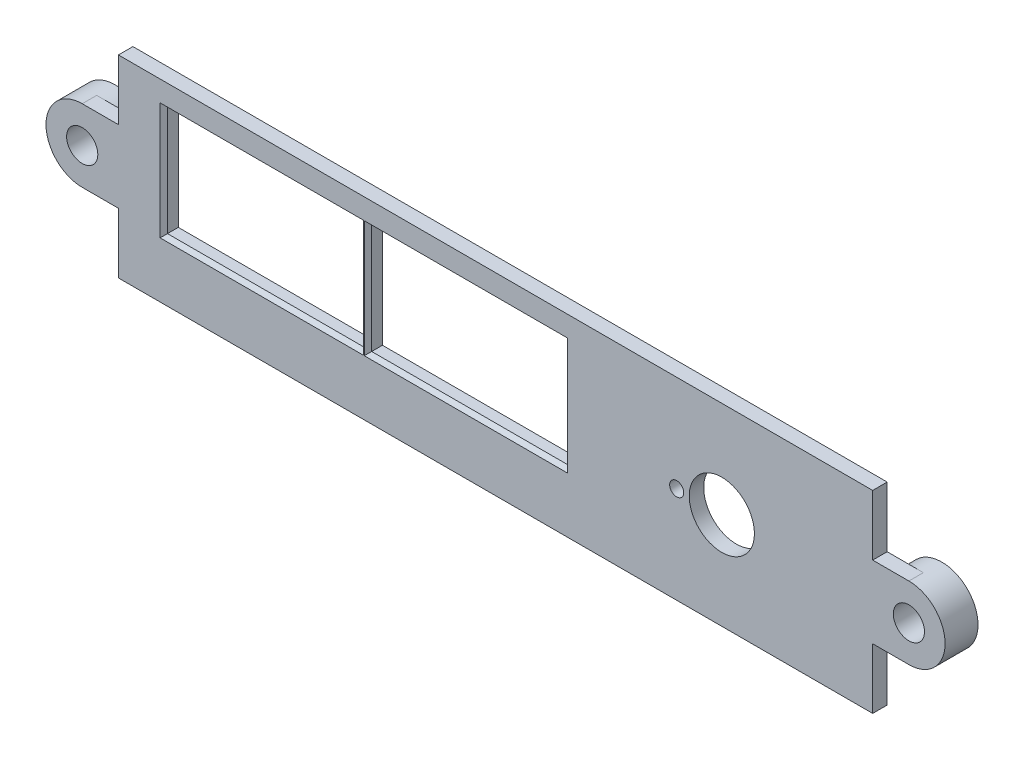
ISO-10303-21;
HEADER;
FILE_DESCRIPTION(('STEP AP214'),'2;1');
FILE_NAME('part.step','',(''),(''),'','','');
FILE_SCHEMA(('AUTOMOTIVE_DESIGN { 1 0 10303 214 1 1 1 1 }'));
ENDSEC;
DATA;
#1=APPLICATION_CONTEXT('core data for automotive mechanical design processes');
#2=APPLICATION_PROTOCOL_DEFINITION('international standard','automotive_design',2000,#1);
#3=PRODUCT_CONTEXT('',#1,'mechanical');
#4=PRODUCT('Part','Part','',(#3));
#5=PRODUCT_RELATED_PRODUCT_CATEGORY('part','',(#4));
#6=PRODUCT_DEFINITION_FORMATION('','',#4);
#7=PRODUCT_DEFINITION_CONTEXT('part definition',#1,'design');
#8=PRODUCT_DEFINITION('design','',#6,#7);
#9=PRODUCT_DEFINITION_SHAPE('','',#8);
#10=(LENGTH_UNIT() NAMED_UNIT(*) SI_UNIT(.MILLI.,.METRE.));
#11=(NAMED_UNIT(*) PLANE_ANGLE_UNIT() SI_UNIT($,.RADIAN.));
#12=(NAMED_UNIT(*) SI_UNIT($,.STERADIAN.) SOLID_ANGLE_UNIT());
#13=UNCERTAINTY_MEASURE_WITH_UNIT(LENGTH_MEASURE(1.E-05),#10,'distance_accuracy_value','');
#14=(GEOMETRIC_REPRESENTATION_CONTEXT(3) GLOBAL_UNCERTAINTY_ASSIGNED_CONTEXT((#13)) GLOBAL_UNIT_ASSIGNED_CONTEXT((#10,
#11,#12)) REPRESENTATION_CONTEXT('',''));
#15=CARTESIAN_POINT('',(0.,0.,0.));
#16=DIRECTION('',(0.,0.,1.));
#17=DIRECTION('',(1.,0.,0.));
#18=AXIS2_PLACEMENT_3D('',#15,#16,#17);
#19=CARTESIAN_POINT('',(-52.07,-13.335,2.));
#20=DIRECTION('',(1.,0.,0.));
#21=DIRECTION('',(0.,0.,-1.));
#22=AXIS2_PLACEMENT_3D('',#19,#20,#21);
#23=PLANE('',#22);
#24=DIRECTION('',(0.,-1.,0.));
#25=VECTOR('',#24,1.);
#26=CARTESIAN_POINT('',(-52.07,-13.335,0.));
#27=LINE('',#26,#25);
#28=CARTESIAN_POINT('',(-52.07,-5.00000016,0.));
#29=VERTEX_POINT('',#28);
#30=CARTESIAN_POINT('',(-52.07,-13.335,0.));
#31=VERTEX_POINT('',#30);
#32=EDGE_CURVE('E415',#29,#31,#27,.T.);
#33=ORIENTED_EDGE('',*,*,#32,.T.);
#34=DIRECTION('',(0.,0.,-1.));
#35=VECTOR('',#34,1.);
#36=CARTESIAN_POINT('',(-52.07,-13.335,2.));
#37=LINE('',#36,#35);
#38=CARTESIAN_POINT('',(-52.07,-13.335,2.));
#39=VERTEX_POINT('',#38);
#40=EDGE_CURVE('E419',#39,#31,#37,.T.);
#41=ORIENTED_EDGE('',*,*,#40,.F.);
#42=DIRECTION('',(0.,-1.,0.));
#43=VECTOR('',#42,1.);
#44=CARTESIAN_POINT('',(-52.07,-13.335,2.));
#45=LINE('',#44,#43);
#46=CARTESIAN_POINT('',(-52.07,-5.00000016,2.));
#47=VERTEX_POINT('',#46);
#48=EDGE_CURVE('E426',#47,#39,#45,.T.);
#49=ORIENTED_EDGE('',*,*,#48,.F.);
#50=DIRECTION('',(0.,0.,-1.));
#51=VECTOR('',#50,1.);
#52=CARTESIAN_POINT('',(-52.07,-5.00000016,2.));
#53=LINE('',#52,#51);
#54=EDGE_CURVE('E464',#47,#29,#53,.T.);
#55=ORIENTED_EDGE('',*,*,#54,.T.);
#56=EDGE_LOOP('',(#33,#41,#49,#55));
#57=FACE_BOUND('',#56,.T.);
#58=ADVANCED_FACE('F47',(#57),#23,.F.);
#59=CARTESIAN_POINT('',(-52.07,-13.335,2.));
#60=DIRECTION('',(0.,1.,0.));
#61=DIRECTION('',(-1.,0.,0.));
#62=AXIS2_PLACEMENT_3D('',#59,#60,#61);
#63=PLANE('',#62);
#64=DIRECTION('',(1.,0.,0.));
#65=VECTOR('',#64,1.);
#66=CARTESIAN_POINT('',(-52.07,-13.335,0.));
#67=LINE('',#66,#65);
#68=CARTESIAN_POINT('',(52.07,-13.335,0.));
#69=VERTEX_POINT('',#68);
#70=EDGE_CURVE('E468',#31,#69,#67,.T.);
#71=ORIENTED_EDGE('',*,*,#70,.T.);
#72=DIRECTION('',(0.,0.,-1.));
#73=VECTOR('',#72,1.);
#74=CARTESIAN_POINT('',(52.07,-13.335,2.));
#75=LINE('',#74,#73);
#76=CARTESIAN_POINT('',(52.07,-13.335,2.));
#77=VERTEX_POINT('',#76);
#78=EDGE_CURVE('E535',#77,#69,#75,.T.);
#79=ORIENTED_EDGE('',*,*,#78,.F.);
#80=DIRECTION('',(1.,0.,0.));
#81=VECTOR('',#80,1.);
#82=CARTESIAN_POINT('',(-52.07,-13.335,2.));
#83=LINE('',#82,#81);
#84=EDGE_CURVE('E430',#39,#77,#83,.T.);
#85=ORIENTED_EDGE('',*,*,#84,.F.);
#86=ORIENTED_EDGE('',*,*,#40,.T.);
#87=EDGE_LOOP('',(#71,#79,#85,#86));
#88=FACE_BOUND('',#87,.T.);
#89=ADVANCED_FACE('F582',(#88),#63,.F.);
#90=CARTESIAN_POINT('',(52.07,-13.335,2.));
#91=DIRECTION('',(-1.,0.,0.));
#92=DIRECTION('',(0.,0.,1.));
#93=AXIS2_PLACEMENT_3D('',#90,#91,#92);
#94=PLANE('',#93);
#95=DIRECTION('',(0.,1.,0.));
#96=VECTOR('',#95,1.);
#97=CARTESIAN_POINT('',(52.07,-13.335,0.));
#98=LINE('',#97,#96);
#99=CARTESIAN_POINT('',(52.07,-5.00000015999999,0.));
#100=VERTEX_POINT('',#99);
#101=EDGE_CURVE('E471',#69,#100,#98,.T.);
#102=ORIENTED_EDGE('',*,*,#101,.T.);
#103=DIRECTION('',(0.,0.,-1.));
#104=VECTOR('',#103,1.);
#105=CARTESIAN_POINT('',(52.07,-5.00000015999999,2.));
#106=LINE('',#105,#104);
#107=CARTESIAN_POINT('',(52.07,-5.00000015999999,2.));
#108=VERTEX_POINT('',#107);
#109=EDGE_CURVE('E531',#108,#100,#106,.T.);
#110=ORIENTED_EDGE('',*,*,#109,.F.);
#111=DIRECTION('',(0.,1.,0.));
#112=VECTOR('',#111,1.);
#113=CARTESIAN_POINT('',(52.07,-13.335,2.));
#114=LINE('',#113,#112);
#115=EDGE_CURVE('E434',#77,#108,#114,.T.);
#116=ORIENTED_EDGE('',*,*,#115,.F.);
#117=ORIENTED_EDGE('',*,*,#78,.T.);
#118=EDGE_LOOP('',(#102,#110,#116,#117));
#119=FACE_BOUND('',#118,.T.);
#120=ADVANCED_FACE('F588',(#119),#94,.F.);
#121=CARTESIAN_POINT('',(57.07000016,-5.00000015999999,2.));
#122=DIRECTION('',(0.,1.,0.));
#123=DIRECTION('',(-1.,0.,0.));
#124=AXIS2_PLACEMENT_3D('',#121,#122,#123);
#125=PLANE('',#124);
#126=DIRECTION('',(1.,0.,0.));
#127=VECTOR('',#126,1.);
#128=CARTESIAN_POINT('',(57.07000016,-5.00000015999999,0.));
#129=LINE('',#128,#127);
#130=CARTESIAN_POINT('',(57.07000016,-5.00000015999999,0.));
#131=VERTEX_POINT('',#130);
#132=EDGE_CURVE('E474',#100,#131,#129,.T.);
#133=ORIENTED_EDGE('',*,*,#132,.T.);
#134=DIRECTION('',(0.,0.,-1.));
#135=VECTOR('',#134,1.);
#136=CARTESIAN_POINT('',(57.07000016,-5.00000015999999,2.));
#137=LINE('',#136,#135);
#138=CARTESIAN_POINT('',(57.07000016,-5.00000015999999,2.));
#139=VERTEX_POINT('',#138);
#140=EDGE_CURVE('E527',#139,#131,#137,.T.);
#141=ORIENTED_EDGE('',*,*,#140,.F.);
#142=DIRECTION('',(1.,0.,0.));
#143=VECTOR('',#142,1.);
#144=CARTESIAN_POINT('',(57.07000016,-5.00000015999999,2.));
#145=LINE('',#144,#143);
#146=EDGE_CURVE('E437',#108,#139,#145,.T.);
#147=ORIENTED_EDGE('',*,*,#146,.F.);
#148=ORIENTED_EDGE('',*,*,#109,.T.);
#149=EDGE_LOOP('',(#133,#141,#147,#148));
#150=FACE_BOUND('',#149,.T.);
#151=ADVANCED_FACE('F824',(#150),#125,.F.);
#152=CARTESIAN_POINT('',(57.07000016,0.,2.));
#153=DIRECTION('',(0.,0.,-1.));
#154=DIRECTION('',(-1.,0.,0.));
#155=AXIS2_PLACEMENT_3D('',#152,#153,#154);
#156=CYLINDRICAL_SURFACE('',#155,5.00000016);
#157=ORIENTED_EDGE('',*,*,#140,.T.);
#158=CARTESIAN_POINT('',(57.07000016,0.,0.));
#159=DIRECTION('',(0.,0.,1.));
#160=DIRECTION('',(1.,0.,0.));
#161=AXIS2_PLACEMENT_3D('',#158,#159,#160);
#162=CIRCLE('',#161,5.00000016);
#163=CARTESIAN_POINT('',(57.07000016,5.00000016000001,0.));
#164=VERTEX_POINT('',#163);
#165=EDGE_CURVE('E416',#164,#131,#162,.T.);
#166=ORIENTED_EDGE('',*,*,#165,.F.);
#167=DIRECTION('',(0.,0.,-1.));
#168=VECTOR('',#167,1.);
#169=CARTESIAN_POINT('',(57.07000016,5.00000016000001,2.));
#170=LINE('',#169,#168);
#171=CARTESIAN_POINT('',(57.07000016,5.00000016000001,2.));
#172=VERTEX_POINT('',#171);
#173=EDGE_CURVE('E523',#172,#164,#170,.T.);
#174=ORIENTED_EDGE('',*,*,#173,.F.);
#175=CARTESIAN_POINT('',(57.07000016,0.,2.));
#176=DIRECTION('',(0.,0.,1.));
#177=DIRECTION('',(-1.,0.,0.));
#178=AXIS2_PLACEMENT_3D('',#175,#176,#177);
#179=CIRCLE('',#178,5.00000016);
#180=EDGE_CURVE('E440',#139,#172,#179,.T.);
#181=ORIENTED_EDGE('',*,*,#180,.F.);
#182=EDGE_LOOP('',(#157,#166,#174,#181));
#183=FACE_BOUND('',#182,.T.);
#184=CARTESIAN_POINT('',(57.07000016,0.,-2.54));
#185=DIRECTION('',(0.,0.,1.));
#186=DIRECTION('',(1.,0.,0.));
#187=AXIS2_PLACEMENT_3D('',#184,#185,#186);
#188=CIRCLE('',#187,5.00000016);
#189=CARTESIAN_POINT('',(62.07000032,0.,-2.54));
#190=VERTEX_POINT('',#189);
#191=EDGE_CURVE('E422',#190,#190,#188,.T.);
#192=ORIENTED_EDGE('',*,*,#191,.T.);
#193=EDGE_LOOP('',(#192));
#194=FACE_BOUND('',#193,.T.);
#195=ADVANCED_FACE('F817',(#183,#194),#156,.T.);
#196=CARTESIAN_POINT('',(52.07,5.00000016000002,2.));
#197=DIRECTION('',(0.,-1.,0.));
#198=DIRECTION('',(1.,0.,0.));
#199=AXIS2_PLACEMENT_3D('',#196,#197,#198);
#200=PLANE('',#199);
#201=DIRECTION('',(-1.,0.,0.));
#202=VECTOR('',#201,1.);
#203=CARTESIAN_POINT('',(52.07,5.00000016000002,0.));
#204=LINE('',#203,#202);
#205=CARTESIAN_POINT('',(52.07,5.00000016000002,0.));
#206=VERTEX_POINT('',#205);
#207=EDGE_CURVE('E478',#164,#206,#204,.T.);
#208=ORIENTED_EDGE('',*,*,#207,.T.);
#209=DIRECTION('',(0.,0.,-1.));
#210=VECTOR('',#209,1.);
#211=CARTESIAN_POINT('',(52.07,5.00000016000002,2.));
#212=LINE('',#211,#210);
#213=CARTESIAN_POINT('',(52.07,5.00000016000002,2.));
#214=VERTEX_POINT('',#213);
#215=EDGE_CURVE('E519',#214,#206,#212,.T.);
#216=ORIENTED_EDGE('',*,*,#215,.F.);
#217=DIRECTION('',(-1.,0.,0.));
#218=VECTOR('',#217,1.);
#219=CARTESIAN_POINT('',(52.07,5.00000016000002,2.));
#220=LINE('',#219,#218);
#221=EDGE_CURVE('E443',#172,#214,#220,.T.);
#222=ORIENTED_EDGE('',*,*,#221,.F.);
#223=ORIENTED_EDGE('',*,*,#173,.T.);
#224=EDGE_LOOP('',(#208,#216,#222,#223));
#225=FACE_BOUND('',#224,.T.);
#226=ADVANCED_FACE('F823',(#225),#200,.F.);
#227=CARTESIAN_POINT('',(52.07,5.00000016000002,2.));
#228=DIRECTION('',(-1.,0.,0.));
#229=DIRECTION('',(0.,0.,1.));
#230=AXIS2_PLACEMENT_3D('',#227,#228,#229);
#231=PLANE('',#230);
#232=DIRECTION('',(0.,1.,0.));
#233=VECTOR('',#232,1.);
#234=CARTESIAN_POINT('',(52.07,5.00000016000002,0.));
#235=LINE('',#234,#233);
#236=CARTESIAN_POINT('',(52.07,13.335,0.));
#237=VERTEX_POINT('',#236);
#238=EDGE_CURVE('E481',#206,#237,#235,.T.);
#239=ORIENTED_EDGE('',*,*,#238,.T.);
#240=DIRECTION('',(0.,0.,-1.));
#241=VECTOR('',#240,1.);
#242=CARTESIAN_POINT('',(52.07,13.335,2.));
#243=LINE('',#242,#241);
#244=CARTESIAN_POINT('',(52.07,13.335,2.));
#245=VERTEX_POINT('',#244);
#246=EDGE_CURVE('E515',#245,#237,#243,.T.);
#247=ORIENTED_EDGE('',*,*,#246,.F.);
#248=DIRECTION('',(0.,1.,0.));
#249=VECTOR('',#248,1.);
#250=CARTESIAN_POINT('',(52.07,5.00000016000002,2.));
#251=LINE('',#250,#249);
#252=EDGE_CURVE('E446',#214,#245,#251,.T.);
#253=ORIENTED_EDGE('',*,*,#252,.F.);
#254=ORIENTED_EDGE('',*,*,#215,.T.);
#255=EDGE_LOOP('',(#239,#247,#253,#254));
#256=FACE_BOUND('',#255,.T.);
#257=ADVANCED_FACE('F877',(#256),#231,.F.);
#258=CARTESIAN_POINT('',(-52.07,13.335,2.));
#259=DIRECTION('',(0.,-1.,0.));
#260=DIRECTION('',(1.,0.,0.));
#261=AXIS2_PLACEMENT_3D('',#258,#259,#260);
#262=PLANE('',#261);
#263=DIRECTION('',(-1.,0.,0.));
#264=VECTOR('',#263,1.);
#265=CARTESIAN_POINT('',(-52.07,13.335,0.));
#266=LINE('',#265,#264);
#267=CARTESIAN_POINT('',(-52.07,13.335,0.));
#268=VERTEX_POINT('',#267);
#269=EDGE_CURVE('E484',#237,#268,#266,.T.);
#270=ORIENTED_EDGE('',*,*,#269,.T.);
#271=DIRECTION('',(0.,0.,-1.));
#272=VECTOR('',#271,1.);
#273=CARTESIAN_POINT('',(-52.07,13.335,2.));
#274=LINE('',#273,#272);
#275=CARTESIAN_POINT('',(-52.07,13.335,2.));
#276=VERTEX_POINT('',#275);
#277=EDGE_CURVE('E511',#276,#268,#274,.T.);
#278=ORIENTED_EDGE('',*,*,#277,.F.);
#279=DIRECTION('',(-1.,0.,0.));
#280=VECTOR('',#279,1.);
#281=CARTESIAN_POINT('',(-52.07,13.335,2.));
#282=LINE('',#281,#280);
#283=EDGE_CURVE('E449',#245,#276,#282,.T.);
#284=ORIENTED_EDGE('',*,*,#283,.F.);
#285=ORIENTED_EDGE('',*,*,#246,.T.);
#286=EDGE_LOOP('',(#270,#278,#284,#285));
#287=FACE_BOUND('',#286,.T.);
#288=ADVANCED_FACE('F868',(#287),#262,.F.);
#289=CARTESIAN_POINT('',(-52.07,5.00000016,2.));
#290=DIRECTION('',(1.,0.,0.));
#291=DIRECTION('',(0.,0.,-1.));
#292=AXIS2_PLACEMENT_3D('',#289,#290,#291);
#293=PLANE('',#292);
#294=DIRECTION('',(0.,-1.,0.));
#295=VECTOR('',#294,1.);
#296=CARTESIAN_POINT('',(-52.07,5.00000016,0.));
#297=LINE('',#296,#295);
#298=CARTESIAN_POINT('',(-52.07,5.00000016,0.));
#299=VERTEX_POINT('',#298);
#300=EDGE_CURVE('E487',#268,#299,#297,.T.);
#301=ORIENTED_EDGE('',*,*,#300,.T.);
#302=DIRECTION('',(0.,0.,-1.));
#303=VECTOR('',#302,1.);
#304=CARTESIAN_POINT('',(-52.07,5.00000016,2.));
#305=LINE('',#304,#303);
#306=CARTESIAN_POINT('',(-52.07,5.00000016,2.));
#307=VERTEX_POINT('',#306);
#308=EDGE_CURVE('E507',#307,#299,#305,.T.);
#309=ORIENTED_EDGE('',*,*,#308,.F.);
#310=DIRECTION('',(0.,-1.,0.));
#311=VECTOR('',#310,1.);
#312=CARTESIAN_POINT('',(-52.07,5.00000016,2.));
#313=LINE('',#312,#311);
#314=EDGE_CURVE('E452',#276,#307,#313,.T.);
#315=ORIENTED_EDGE('',*,*,#314,.F.);
#316=ORIENTED_EDGE('',*,*,#277,.T.);
#317=EDGE_LOOP('',(#301,#309,#315,#316));
#318=FACE_BOUND('',#317,.T.);
#319=ADVANCED_FACE('F859',(#318),#293,.F.);
#320=CARTESIAN_POINT('',(-52.07,5.00000016,2.));
#321=DIRECTION('',(0.,-1.,0.));
#322=DIRECTION('',(1.,0.,0.));
#323=AXIS2_PLACEMENT_3D('',#320,#321,#322);
#324=PLANE('',#323);
#325=DIRECTION('',(-1.,0.,0.));
#326=VECTOR('',#325,1.);
#327=CARTESIAN_POINT('',(-52.07,5.00000016,0.));
#328=LINE('',#327,#326);
#329=CARTESIAN_POINT('',(-57.07000016,5.00000016,0.));
#330=VERTEX_POINT('',#329);
#331=EDGE_CURVE('E490',#299,#330,#328,.T.);
#332=ORIENTED_EDGE('',*,*,#331,.T.);
#333=DIRECTION('',(0.,0.,-1.));
#334=VECTOR('',#333,1.);
#335=CARTESIAN_POINT('',(-57.07000016,5.00000016,2.));
#336=LINE('',#335,#334);
#337=CARTESIAN_POINT('',(-57.07000016,5.00000016,2.));
#338=VERTEX_POINT('',#337);
#339=EDGE_CURVE('E503',#338,#330,#336,.T.);
#340=ORIENTED_EDGE('',*,*,#339,.F.);
#341=DIRECTION('',(-1.,0.,0.));
#342=VECTOR('',#341,1.);
#343=CARTESIAN_POINT('',(-52.07,5.00000016,2.));
#344=LINE('',#343,#342);
#345=EDGE_CURVE('E455',#307,#338,#344,.T.);
#346=ORIENTED_EDGE('',*,*,#345,.F.);
#347=ORIENTED_EDGE('',*,*,#308,.T.);
#348=EDGE_LOOP('',(#332,#340,#346,#347));
#349=FACE_BOUND('',#348,.T.);
#350=ADVANCED_FACE('F807',(#349),#324,.F.);
#351=CARTESIAN_POINT('',(-57.07000016,0.,2.));
#352=DIRECTION('',(0.,0.,-1.));
#353=DIRECTION('',(-1.,0.,0.));
#354=AXIS2_PLACEMENT_3D('',#351,#352,#353);
#355=CYLINDRICAL_SURFACE('',#354,5.00000016);
#356=ORIENTED_EDGE('',*,*,#339,.T.);
#357=CARTESIAN_POINT('',(-57.07000016,0.,0.));
#358=DIRECTION('',(0.,0.,1.));
#359=DIRECTION('',(1.,0.,0.));
#360=AXIS2_PLACEMENT_3D('',#357,#358,#359);
#361=CIRCLE('',#360,5.00000016);
#362=CARTESIAN_POINT('',(-57.07000016,-5.00000016,0.));
#363=VERTEX_POINT('',#362);
#364=EDGE_CURVE('E226',#363,#330,#361,.T.);
#365=ORIENTED_EDGE('',*,*,#364,.F.);
#366=DIRECTION('',(0.,0.,-1.));
#367=VECTOR('',#366,1.);
#368=CARTESIAN_POINT('',(-57.07000016,-5.00000016,2.));
#369=LINE('',#368,#367);
#370=CARTESIAN_POINT('',(-57.07000016,-5.00000016,2.));
#371=VERTEX_POINT('',#370);
#372=EDGE_CURVE('E499',#371,#363,#369,.T.);
#373=ORIENTED_EDGE('',*,*,#372,.F.);
#374=CARTESIAN_POINT('',(-57.07000016,0.,2.));
#375=DIRECTION('',(0.,0.,1.));
#376=DIRECTION('',(1.,0.,0.));
#377=AXIS2_PLACEMENT_3D('',#374,#375,#376);
#378=CIRCLE('',#377,5.00000016);
#379=EDGE_CURVE('E458',#338,#371,#378,.T.);
#380=ORIENTED_EDGE('',*,*,#379,.F.);
#381=EDGE_LOOP('',(#356,#365,#373,#380));
#382=FACE_BOUND('',#381,.T.);
#383=CARTESIAN_POINT('',(-57.07000016,0.,-2.54));
#384=DIRECTION('',(0.,0.,1.));
#385=DIRECTION('',(1.,0.,0.));
#386=AXIS2_PLACEMENT_3D('',#383,#384,#385);
#387=CIRCLE('',#386,5.00000016);
#388=CARTESIAN_POINT('',(-52.07,0.,-2.54));
#389=VERTEX_POINT('',#388);
#390=EDGE_CURVE('E411',#389,#389,#387,.T.);
#391=ORIENTED_EDGE('',*,*,#390,.T.);
#392=EDGE_LOOP('',(#391));
#393=FACE_BOUND('',#392,.T.);
#394=ADVANCED_FACE('F800',(#382,#393),#355,.T.);
#395=CARTESIAN_POINT('',(-57.07000016,-5.00000016,2.));
#396=DIRECTION('',(0.,1.,0.));
#397=DIRECTION('',(-1.,0.,0.));
#398=AXIS2_PLACEMENT_3D('',#395,#396,#397);
#399=PLANE('',#398);
#400=DIRECTION('',(1.,0.,0.));
#401=VECTOR('',#400,1.);
#402=CARTESIAN_POINT('',(-57.07000016,-5.00000016,0.));
#403=LINE('',#402,#401);
#404=EDGE_CURVE('E431',#363,#29,#403,.T.);
#405=ORIENTED_EDGE('',*,*,#404,.T.);
#406=ORIENTED_EDGE('',*,*,#54,.F.);
#407=DIRECTION('',(1.,0.,0.));
#408=VECTOR('',#407,1.);
#409=CARTESIAN_POINT('',(-57.07000016,-5.00000016,2.));
#410=LINE('',#409,#408);
#411=EDGE_CURVE('E461',#371,#47,#410,.T.);
#412=ORIENTED_EDGE('',*,*,#411,.F.);
#413=ORIENTED_EDGE('',*,*,#372,.T.);
#414=EDGE_LOOP('',(#405,#406,#412,#413));
#415=FACE_BOUND('',#414,.T.);
#416=ADVANCED_FACE('F806',(#415),#399,.F.);
#417=CARTESIAN_POINT('',(-57.07000016,0.,2.));
#418=DIRECTION('',(0.,0.,1.));
#419=DIRECTION('',(1.,0.,0.));
#420=AXIS2_PLACEMENT_3D('',#417,#418,#419);
#421=PLANE('',#420);
#422=DIRECTION('',(0.,-1.,0.));
#423=VECTOR('',#422,1.);
#424=CARTESIAN_POINT('',(9.96300527650545,-5.15299999999999,2.));
#425=LINE('',#424,#423);
#426=CARTESIAN_POINT('',(9.96300527650545,10.487,2.));
#427=VERTEX_POINT('',#426);
#428=CARTESIAN_POINT('',(9.96300527650545,-5.66099999999999,2.));
#429=VERTEX_POINT('',#428);
#430=EDGE_CURVE('E296',#427,#429,#425,.T.);
#431=ORIENTED_EDGE('',*,*,#430,.T.);
#432=DIRECTION('',(-1.,0.,0.));
#433=VECTOR('',#432,1.);
#434=CARTESIAN_POINT('',(-17.6149947234945,-5.66099999999999,2.));
#435=LINE('',#434,#433);
#436=CARTESIAN_POINT('',(-18.1229947234945,-5.66099999999999,2.));
#437=VERTEX_POINT('',#436);
#438=EDGE_CURVE('E299',#429,#437,#435,.T.);
#439=ORIENTED_EDGE('',*,*,#438,.T.);
#440=DIRECTION('',(0.,1.,0.));
#441=VECTOR('',#440,1.);
#442=CARTESIAN_POINT('',(-18.1229947234945,9.979,2.));
#443=LINE('',#442,#441);
#444=CARTESIAN_POINT('',(-18.1229947234945,10.487,2.));
#445=VERTEX_POINT('',#444);
#446=EDGE_CURVE('E290',#437,#445,#443,.T.);
#447=ORIENTED_EDGE('',*,*,#446,.T.);
#448=DIRECTION('',(1.,0.,0.));
#449=VECTOR('',#448,1.);
#450=CARTESIAN_POINT('',(9.45500527650545,10.487,2.));
#451=LINE('',#450,#449);
#452=EDGE_CURVE('E293',#445,#427,#451,.T.);
#453=ORIENTED_EDGE('',*,*,#452,.T.);
#454=EDGE_LOOP('',(#431,#439,#447,#453));
#455=FACE_BOUND('',#454,.T.);
#456=DIRECTION('',(1.,0.,0.));
#457=VECTOR('',#456,1.);
#458=CARTESIAN_POINT('',(-18.7349947314945,10.487,2.));
#459=LINE('',#458,#457);
#460=CARTESIAN_POINT('',(-46.3129947314945,10.487,2.));
#461=VERTEX_POINT('',#460);
#462=CARTESIAN_POINT('',(-18.2269947314945,10.487,2.));
#463=VERTEX_POINT('',#462);
#464=EDGE_CURVE('E283',#461,#463,#459,.T.);
#465=ORIENTED_EDGE('',*,*,#464,.T.);
#466=DIRECTION('',(0.,-1.,0.));
#467=VECTOR('',#466,1.);
#468=CARTESIAN_POINT('',(-18.2269947314945,-5.15299999999999,2.));
#469=LINE('',#468,#467);
#470=CARTESIAN_POINT('',(-18.2269947314945,-5.661,2.));
#471=VERTEX_POINT('',#470);
#472=EDGE_CURVE('E286',#463,#471,#469,.T.);
#473=ORIENTED_EDGE('',*,*,#472,.T.);
#474=DIRECTION('',(-1.,0.,0.));
#475=VECTOR('',#474,1.);
#476=CARTESIAN_POINT('',(-45.8049947314945,-5.66100000000001,2.));
#477=LINE('',#476,#475);
#478=CARTESIAN_POINT('',(-46.3129947314945,-5.66100000000001,2.));
#479=VERTEX_POINT('',#478);
#480=EDGE_CURVE('E277',#471,#479,#477,.T.);
#481=ORIENTED_EDGE('',*,*,#480,.T.);
#482=DIRECTION('',(0.,1.,0.));
#483=VECTOR('',#482,1.);
#484=CARTESIAN_POINT('',(-46.3129947314945,9.97899999999999,2.));
#485=LINE('',#484,#483);
#486=EDGE_CURVE('E280',#479,#461,#485,.T.);
#487=ORIENTED_EDGE('',*,*,#486,.T.);
#488=EDGE_LOOP('',(#465,#473,#481,#487));
#489=FACE_BOUND('',#488,.T.);
#490=CARTESIAN_POINT('',(25.0108070921358,0.,2.));
#491=DIRECTION('',(0.,0.,1.));
#492=DIRECTION('',(1.,0.,0.));
#493=AXIS2_PLACEMENT_3D('',#490,#491,#492);
#494=CIRCLE('',#493,0.972415319573671);
#495=CARTESIAN_POINT('',(25.9832224117095,0.,2.));
#496=VERTEX_POINT('',#495);
#497=EDGE_CURVE('E333',#496,#496,#494,.T.);
#498=ORIENTED_EDGE('',*,*,#497,.F.);
#499=EDGE_LOOP('',(#498));
#500=FACE_BOUND('',#499,.T.);
#501=CARTESIAN_POINT('',(31.2400052765055,0.,2.));
#502=DIRECTION('',(0.,0.,1.));
#503=DIRECTION('',(1.,0.,0.));
#504=AXIS2_PLACEMENT_3D('',#501,#502,#503);
#505=CIRCLE('',#504,4.5);
#506=CARTESIAN_POINT('',(35.7400052765055,0.,2.));
#507=VERTEX_POINT('',#506);
#508=EDGE_CURVE('E380',#507,#507,#505,.T.);
#509=ORIENTED_EDGE('',*,*,#508,.F.);
#510=EDGE_LOOP('',(#509));
#511=FACE_BOUND('',#510,.T.);
#512=CARTESIAN_POINT('',(-57.07000016,0.,2.));
#513=DIRECTION('',(0.,0.,1.));
#514=DIRECTION('',(1.,0.,0.));
#515=AXIS2_PLACEMENT_3D('',#512,#513,#514);
#516=CIRCLE('',#515,2.15264999999999);
#517=CARTESIAN_POINT('',(-54.91735016,0.,2.));
#518=VERTEX_POINT('',#517);
#519=EDGE_CURVE('E401',#518,#518,#516,.T.);
#520=ORIENTED_EDGE('',*,*,#519,.F.);
#521=EDGE_LOOP('',(#520));
#522=FACE_BOUND('',#521,.T.);
#523=CARTESIAN_POINT('',(57.07000016,0.,2.));
#524=DIRECTION('',(0.,0.,1.));
#525=DIRECTION('',(1.,0.,0.));
#526=AXIS2_PLACEMENT_3D('',#523,#524,#525);
#527=CIRCLE('',#526,2.15264999999999);
#528=CARTESIAN_POINT('',(59.22265016,0.,2.));
#529=VERTEX_POINT('',#528);
#530=EDGE_CURVE('E410',#529,#529,#527,.T.);
#531=ORIENTED_EDGE('',*,*,#530,.F.);
#532=EDGE_LOOP('',(#531));
#533=FACE_BOUND('',#532,.T.);
#534=ORIENTED_EDGE('',*,*,#48,.T.);
#535=ORIENTED_EDGE('',*,*,#84,.T.);
#536=ORIENTED_EDGE('',*,*,#115,.T.);
#537=ORIENTED_EDGE('',*,*,#146,.T.);
#538=ORIENTED_EDGE('',*,*,#180,.T.);
#539=ORIENTED_EDGE('',*,*,#221,.T.);
#540=ORIENTED_EDGE('',*,*,#252,.T.);
#541=ORIENTED_EDGE('',*,*,#283,.T.);
#542=ORIENTED_EDGE('',*,*,#314,.T.);
#543=ORIENTED_EDGE('',*,*,#345,.T.);
#544=ORIENTED_EDGE('',*,*,#379,.T.);
#545=ORIENTED_EDGE('',*,*,#411,.T.);
#546=EDGE_LOOP('',(#534,#535,#536,#537,#538,#539,#540,#541,#542,#543,#544,#545));
#547=FACE_BOUND('',#546,.T.);
#548=ADVANCED_FACE('F356',(#455,#489,#500,#511,#522,#533,#547),#421,.T.);
#549=CARTESIAN_POINT('',(-57.07000016,0.,0.));
#550=DIRECTION('',(0.,0.,1.));
#551=DIRECTION('',(1.,0.,0.));
#552=AXIS2_PLACEMENT_3D('',#549,#550,#551);
#553=PLANE('',#552);
#554=DIRECTION('',(1.,0.,0.));
#555=VECTOR('',#554,1.);
#556=CARTESIAN_POINT('',(-57.07000016,-5.153,0.));
#557=LINE('',#556,#555);
#558=CARTESIAN_POINT('',(-45.8049947314945,-5.153,0.));
#559=VERTEX_POINT('',#558);
#560=CARTESIAN_POINT('',(-18.7349947314945,-5.15299999999999,0.));
#561=VERTEX_POINT('',#560);
#562=EDGE_CURVE('E266',#559,#561,#557,.T.);
#563=ORIENTED_EDGE('',*,*,#562,.T.);
#564=DIRECTION('',(0.,1.,0.));
#565=VECTOR('',#564,1.);
#566=CARTESIAN_POINT('',(-18.7349947314945,0.,0.));
#567=LINE('',#566,#565);
#568=CARTESIAN_POINT('',(-18.7349947314945,9.979,0.));
#569=VERTEX_POINT('',#568);
#570=EDGE_CURVE('E270',#561,#569,#567,.T.);
#571=ORIENTED_EDGE('',*,*,#570,.T.);
#572=DIRECTION('',(-1.,0.,0.));
#573=VECTOR('',#572,1.);
#574=CARTESIAN_POINT('',(-57.07000016,9.97899999999999,0.));
#575=LINE('',#574,#573);
#576=CARTESIAN_POINT('',(-45.8049947314945,9.97899999999999,0.));
#577=VERTEX_POINT('',#576);
#578=EDGE_CURVE('E243',#569,#577,#575,.T.);
#579=ORIENTED_EDGE('',*,*,#578,.T.);
#580=DIRECTION('',(0.,-1.,0.));
#581=VECTOR('',#580,1.);
#582=CARTESIAN_POINT('',(-45.8049947314945,0.,0.));
#583=LINE('',#582,#581);
#584=EDGE_CURVE('E248',#577,#559,#583,.T.);
#585=ORIENTED_EDGE('',*,*,#584,.T.);
#586=EDGE_LOOP('',(#563,#571,#579,#585));
#587=FACE_BOUND('',#586,.T.);
#588=CARTESIAN_POINT('',(25.0108070921358,0.,0.));
#589=DIRECTION('',(0.,0.,1.));
#590=DIRECTION('',(1.,0.,0.));
#591=AXIS2_PLACEMENT_3D('',#588,#589,#590);
#592=CIRCLE('',#591,0.972415319573671);
#593=CARTESIAN_POINT('',(25.9832224117095,0.,0.));
#594=VERTEX_POINT('',#593);
#595=EDGE_CURVE('E257',#594,#594,#592,.T.);
#596=ORIENTED_EDGE('',*,*,#595,.T.);
#597=EDGE_LOOP('',(#596));
#598=FACE_BOUND('',#597,.T.);
#599=CARTESIAN_POINT('',(31.2400052765055,0.,0.));
#600=DIRECTION('',(0.,0.,1.));
#601=DIRECTION('',(1.,0.,0.));
#602=AXIS2_PLACEMENT_3D('',#599,#600,#601);
#603=CIRCLE('',#602,4.5);
#604=CARTESIAN_POINT('',(35.7400052765055,0.,0.));
#605=VERTEX_POINT('',#604);
#606=EDGE_CURVE('E253',#605,#605,#603,.T.);
#607=ORIENTED_EDGE('',*,*,#606,.T.);
#608=EDGE_LOOP('',(#607));
#609=FACE_BOUND('',#608,.T.);
#610=DIRECTION('',(-1.,0.,0.));
#611=VECTOR('',#610,1.);
#612=CARTESIAN_POINT('',(-57.07000016,9.979,0.));
#613=LINE('',#612,#611);
#614=CARTESIAN_POINT('',(9.45500527650545,9.979,0.));
#615=VERTEX_POINT('',#614);
#616=CARTESIAN_POINT('',(-17.6149947234945,9.979,0.));
#617=VERTEX_POINT('',#616);
#618=EDGE_CURVE('E241',#615,#617,#613,.T.);
#619=ORIENTED_EDGE('',*,*,#618,.T.);
#620=DIRECTION('',(0.,-1.,0.));
#621=VECTOR('',#620,1.);
#622=CARTESIAN_POINT('',(-17.6149947234945,0.,0.));
#623=LINE('',#622,#621);
#624=CARTESIAN_POINT('',(-17.6149947234945,-5.15299999999999,0.));
#625=VERTEX_POINT('',#624);
#626=EDGE_CURVE('E231',#617,#625,#623,.T.);
#627=ORIENTED_EDGE('',*,*,#626,.T.);
#628=DIRECTION('',(1.,0.,0.));
#629=VECTOR('',#628,1.);
#630=CARTESIAN_POINT('',(-57.07000016,-5.15299999999999,0.));
#631=LINE('',#630,#629);
#632=CARTESIAN_POINT('',(9.45500527650545,-5.15299999999999,0.));
#633=VERTEX_POINT('',#632);
#634=EDGE_CURVE('E212',#625,#633,#631,.T.);
#635=ORIENTED_EDGE('',*,*,#634,.T.);
#636=DIRECTION('',(0.,1.,0.));
#637=VECTOR('',#636,1.);
#638=CARTESIAN_POINT('',(9.45500527650544,0.,0.));
#639=LINE('',#638,#637);
#640=EDGE_CURVE('E225',#633,#615,#639,.T.);
#641=ORIENTED_EDGE('',*,*,#640,.T.);
#642=EDGE_LOOP('',(#619,#627,#635,#641));
#643=FACE_BOUND('',#642,.T.);
#644=ORIENTED_EDGE('',*,*,#404,.F.);
#645=ORIENTED_EDGE('',*,*,#364,.T.);
#646=ORIENTED_EDGE('',*,*,#331,.F.);
#647=ORIENTED_EDGE('',*,*,#300,.F.);
#648=ORIENTED_EDGE('',*,*,#269,.F.);
#649=ORIENTED_EDGE('',*,*,#238,.F.);
#650=ORIENTED_EDGE('',*,*,#207,.F.);
#651=ORIENTED_EDGE('',*,*,#165,.T.);
#652=ORIENTED_EDGE('',*,*,#132,.F.);
#653=ORIENTED_EDGE('',*,*,#101,.F.);
#654=ORIENTED_EDGE('',*,*,#70,.F.);
#655=ORIENTED_EDGE('',*,*,#32,.F.);
#656=EDGE_LOOP('',(#644,#645,#646,#647,#648,#649,#650,#651,#652,#653,#654,#655));
#657=FACE_BOUND('',#656,.T.);
#658=ADVANCED_FACE('F239',(#587,#598,#609,#643,#657),#553,.F.);
#659=CARTESIAN_POINT('',(57.07000016,0.,-2.54));
#660=DIRECTION('',(0.,0.,1.));
#661=DIRECTION('',(1.,0.,0.));
#662=AXIS2_PLACEMENT_3D('',#659,#660,#661);
#663=PLANE('',#662);
#664=CARTESIAN_POINT('',(57.07000016,0.,-2.54));
#665=DIRECTION('',(0.,0.,-1.));
#666=DIRECTION('',(-1.,0.,0.));
#667=AXIS2_PLACEMENT_3D('',#664,#665,#666);
#668=CIRCLE('',#667,2.54);
#669=CARTESIAN_POINT('',(54.53000016,0.,-2.54));
#670=VERTEX_POINT('',#669);
#671=EDGE_CURVE('E402',#670,#670,#668,.T.);
#672=ORIENTED_EDGE('',*,*,#671,.F.);
#673=EDGE_LOOP('',(#672));
#674=FACE_BOUND('',#673,.T.);
#675=ORIENTED_EDGE('',*,*,#191,.F.);
#676=EDGE_LOOP('',(#675));
#677=FACE_BOUND('',#676,.T.);
#678=ADVANCED_FACE('F784',(#674,#677),#663,.F.);
#679=CARTESIAN_POINT('',(-57.07000016,0.,-2.54));
#680=DIRECTION('',(0.,0.,1.));
#681=DIRECTION('',(1.,0.,0.));
#682=AXIS2_PLACEMENT_3D('',#679,#680,#681);
#683=PLANE('',#682);
#684=CARTESIAN_POINT('',(-57.07000016,0.,-2.54));
#685=DIRECTION('',(0.,0.,-1.));
#686=DIRECTION('',(-1.,0.,0.));
#687=AXIS2_PLACEMENT_3D('',#684,#685,#686);
#688=CIRCLE('',#687,2.54);
#689=CARTESIAN_POINT('',(-59.61000016,0.,-2.54));
#690=VERTEX_POINT('',#689);
#691=EDGE_CURVE('E261',#690,#690,#688,.T.);
#692=ORIENTED_EDGE('',*,*,#691,.F.);
#693=EDGE_LOOP('',(#692));
#694=FACE_BOUND('',#693,.T.);
#695=ORIENTED_EDGE('',*,*,#390,.F.);
#696=EDGE_LOOP('',(#695));
#697=FACE_BOUND('',#696,.T.);
#698=ADVANCED_FACE('F774',(#694,#697),#683,.F.);
#699=CARTESIAN_POINT('',(57.07000016,0.,-2.54));
#700=DIRECTION('',(0.,0.,-1.));
#701=DIRECTION('',(-1.,0.,0.));
#702=AXIS2_PLACEMENT_3D('',#699,#700,#701);
#703=CYLINDRICAL_SURFACE('',#702,2.15264999999999);
#704=ORIENTED_EDGE('',*,*,#530,.T.);
#705=EDGE_LOOP('',(#704));
#706=FACE_BOUND('',#705,.T.);
#707=CARTESIAN_POINT('',(57.07000016,0.,-2.15265));
#708=DIRECTION('',(0.,0.,-1.));
#709=DIRECTION('',(-1.,0.,0.));
#710=AXIS2_PLACEMENT_3D('',#707,#708,#709);
#711=CIRCLE('',#710,2.15265);
#712=CARTESIAN_POINT('',(54.91735016,0.,-2.15265));
#713=VERTEX_POINT('',#712);
#714=EDGE_CURVE('E406',#713,#713,#711,.T.);
#715=ORIENTED_EDGE('',*,*,#714,.T.);
#716=EDGE_LOOP('',(#715));
#717=FACE_BOUND('',#716,.T.);
#718=ADVANCED_FACE('F764',(#706,#717),#703,.F.);
#719=CARTESIAN_POINT('',(57.07000016,0.,-2.54));
#720=DIRECTION('',(0.,0.,-1.));
#721=DIRECTION('',(-1.,0.,0.));
#722=AXIS2_PLACEMENT_3D('',#719,#720,#721);
#723=CONICAL_SURFACE('',#722,2.54,0.785398163397446);
#724=ORIENTED_EDGE('',*,*,#714,.F.);
#725=EDGE_LOOP('',(#724));
#726=FACE_BOUND('',#725,.T.);
#727=ORIENTED_EDGE('',*,*,#671,.T.);
#728=EDGE_LOOP('',(#727));
#729=FACE_BOUND('',#728,.T.);
#730=ADVANCED_FACE('F754',(#726,#729),#723,.F.);
#731=CARTESIAN_POINT('',(-57.07000016,0.,-2.54));
#732=DIRECTION('',(0.,0.,-1.));
#733=DIRECTION('',(-1.,0.,0.));
#734=AXIS2_PLACEMENT_3D('',#731,#732,#733);
#735=CYLINDRICAL_SURFACE('',#734,2.15264999999999);
#736=ORIENTED_EDGE('',*,*,#519,.T.);
#737=EDGE_LOOP('',(#736));
#738=FACE_BOUND('',#737,.T.);
#739=CARTESIAN_POINT('',(-57.07000016,0.,-2.15265));
#740=DIRECTION('',(0.,0.,-1.));
#741=DIRECTION('',(-1.,0.,0.));
#742=AXIS2_PLACEMENT_3D('',#739,#740,#741);
#743=CIRCLE('',#742,2.15265);
#744=CARTESIAN_POINT('',(-59.22265016,0.,-2.15265));
#745=VERTEX_POINT('',#744);
#746=EDGE_CURVE('E397',#745,#745,#743,.T.);
#747=ORIENTED_EDGE('',*,*,#746,.T.);
#748=EDGE_LOOP('',(#747));
#749=FACE_BOUND('',#748,.T.);
#750=ADVANCED_FACE('F744',(#738,#749),#735,.F.);
#751=CARTESIAN_POINT('',(-57.07000016,0.,-2.54));
#752=DIRECTION('',(0.,0.,-1.));
#753=DIRECTION('',(-1.,0.,0.));
#754=AXIS2_PLACEMENT_3D('',#751,#752,#753);
#755=CONICAL_SURFACE('',#754,2.54,0.785398163397446);
#756=ORIENTED_EDGE('',*,*,#746,.F.);
#757=EDGE_LOOP('',(#756));
#758=FACE_BOUND('',#757,.T.);
#759=ORIENTED_EDGE('',*,*,#691,.T.);
#760=EDGE_LOOP('',(#759));
#761=FACE_BOUND('',#760,.T.);
#762=ADVANCED_FACE('F735',(#758,#761),#755,.F.);
#763=CARTESIAN_POINT('',(-17.6149947234945,9.979,-2.54));
#764=DIRECTION('',(-1.,0.,0.));
#765=DIRECTION('',(0.,-1.,0.));
#766=AXIS2_PLACEMENT_3D('',#763,#764,#765);
#767=PLANE('',#766);
#768=DIRECTION('',(0.,0.,1.));
#769=VECTOR('',#768,1.);
#770=CARTESIAN_POINT('',(-17.6149947234945,9.979,-2.54));
#771=LINE('',#770,#769);
#772=CARTESIAN_POINT('',(-17.6149947234945,9.979,1.49199999999999));
#773=VERTEX_POINT('',#772);
#774=EDGE_CURVE('E388',#617,#773,#771,.T.);
#775=ORIENTED_EDGE('',*,*,#774,.T.);
#776=DIRECTION('',(0.,-1.,0.));
#777=VECTOR('',#776,1.);
#778=CARTESIAN_POINT('',(-17.6149947234945,-5.15299999999999,1.49199999999999));
#779=LINE('',#778,#777);
#780=CARTESIAN_POINT('',(-17.6149947234945,-5.15299999999999,1.49199999999999));
#781=VERTEX_POINT('',#780);
#782=EDGE_CURVE('E234',#773,#781,#779,.T.);
#783=ORIENTED_EDGE('',*,*,#782,.T.);
#784=DIRECTION('',(0.,0.,1.));
#785=VECTOR('',#784,1.);
#786=CARTESIAN_POINT('',(-17.6149947234945,-5.15299999999999,-2.54));
#787=LINE('',#786,#785);
#788=EDGE_CURVE('E216',#625,#781,#787,.T.);
#789=ORIENTED_EDGE('',*,*,#788,.F.);
#790=ORIENTED_EDGE('',*,*,#626,.F.);
#791=EDGE_LOOP('',(#775,#783,#789,#790));
#792=FACE_BOUND('',#791,.T.);
#793=ADVANCED_FACE('F230',(#792),#767,.F.);
#794=CARTESIAN_POINT('',(-17.6149947234945,9.979,-2.54));
#795=DIRECTION('',(0.,1.,0.));
#796=DIRECTION('',(0.,0.,1.));
#797=AXIS2_PLACEMENT_3D('',#794,#795,#796);
#798=PLANE('',#797);
#799=DIRECTION('',(0.,0.,1.));
#800=VECTOR('',#799,1.);
#801=CARTESIAN_POINT('',(9.45500527650545,9.979,-2.54));
#802=LINE('',#801,#800);
#803=CARTESIAN_POINT('',(9.45500527650545,9.979,1.49199999999999));
#804=VERTEX_POINT('',#803);
#805=EDGE_CURVE('E384',#615,#804,#802,.T.);
#806=ORIENTED_EDGE('',*,*,#805,.T.);
#807=DIRECTION('',(-1.,0.,0.));
#808=VECTOR('',#807,1.);
#809=CARTESIAN_POINT('',(-17.6149947234945,9.979,1.49199999999999));
#810=LINE('',#809,#808);
#811=EDGE_CURVE('E306',#804,#773,#810,.T.);
#812=ORIENTED_EDGE('',*,*,#811,.T.);
#813=ORIENTED_EDGE('',*,*,#774,.F.);
#814=ORIENTED_EDGE('',*,*,#618,.F.);
#815=EDGE_LOOP('',(#806,#812,#813,#814));
#816=FACE_BOUND('',#815,.T.);
#817=ADVANCED_FACE('F554',(#816),#798,.F.);
#818=CARTESIAN_POINT('',(9.45500527650545,9.979,-2.54));
#819=DIRECTION('',(1.,0.,0.));
#820=DIRECTION('',(0.,1.,0.));
#821=AXIS2_PLACEMENT_3D('',#818,#819,#820);
#822=PLANE('',#821);
#823=DIRECTION('',(0.,0.,1.));
#824=VECTOR('',#823,1.);
#825=CARTESIAN_POINT('',(9.45500527650545,-5.15299999999999,-2.54));
#826=LINE('',#825,#824);
#827=CARTESIAN_POINT('',(9.45500527650545,-5.15299999999999,1.49199999999999));
#828=VERTEX_POINT('',#827);
#829=EDGE_CURVE('E219',#633,#828,#826,.T.);
#830=ORIENTED_EDGE('',*,*,#829,.T.);
#831=DIRECTION('',(0.,1.,0.));
#832=VECTOR('',#831,1.);
#833=CARTESIAN_POINT('',(9.45500527650545,9.979,1.49199999999999));
#834=LINE('',#833,#832);
#835=EDGE_CURVE('E303',#828,#804,#834,.T.);
#836=ORIENTED_EDGE('',*,*,#835,.T.);
#837=ORIENTED_EDGE('',*,*,#805,.F.);
#838=ORIENTED_EDGE('',*,*,#640,.F.);
#839=EDGE_LOOP('',(#830,#836,#837,#838));
#840=FACE_BOUND('',#839,.T.);
#841=ADVANCED_FACE('F550',(#840),#822,.F.);
#842=CARTESIAN_POINT('',(-17.6149947234945,-5.15299999999999,-2.54));
#843=DIRECTION('',(0.,-1.,0.));
#844=DIRECTION('',(0.,0.,-1.));
#845=AXIS2_PLACEMENT_3D('',#842,#843,#844);
#846=PLANE('',#845);
#847=ORIENTED_EDGE('',*,*,#788,.T.);
#848=DIRECTION('',(1.,0.,0.));
#849=VECTOR('',#848,1.);
#850=CARTESIAN_POINT('',(9.45500527650545,-5.15299999999999,1.49199999999999));
#851=LINE('',#850,#849);
#852=EDGE_CURVE('E274',#781,#828,#851,.T.);
#853=ORIENTED_EDGE('',*,*,#852,.T.);
#854=ORIENTED_EDGE('',*,*,#829,.F.);
#855=ORIENTED_EDGE('',*,*,#634,.F.);
#856=EDGE_LOOP('',(#847,#853,#854,#855));
#857=FACE_BOUND('',#856,.T.);
#858=ADVANCED_FACE('F214',(#857),#846,.F.);
#859=CARTESIAN_POINT('',(31.2400052765055,0.,-2.54));
#860=DIRECTION('',(0.,0.,1.));
#861=DIRECTION('',(1.,0.,0.));
#862=AXIS2_PLACEMENT_3D('',#859,#860,#861);
#863=CYLINDRICAL_SURFACE('',#862,4.5);
#864=ORIENTED_EDGE('',*,*,#508,.T.);
#865=EDGE_LOOP('',(#864));
#866=FACE_BOUND('',#865,.T.);
#867=ORIENTED_EDGE('',*,*,#606,.F.);
#868=EDGE_LOOP('',(#867));
#869=FACE_BOUND('',#868,.T.);
#870=ADVANCED_FACE('F691',(#866,#869),#863,.F.);
#871=CARTESIAN_POINT('',(25.0108070921358,0.,-2.54));
#872=DIRECTION('',(0.,0.,1.));
#873=DIRECTION('',(1.,0.,0.));
#874=AXIS2_PLACEMENT_3D('',#871,#872,#873);
#875=CYLINDRICAL_SURFACE('',#874,0.972415319573671);
#876=ORIENTED_EDGE('',*,*,#497,.T.);
#877=EDGE_LOOP('',(#876));
#878=FACE_BOUND('',#877,.T.);
#879=ORIENTED_EDGE('',*,*,#595,.F.);
#880=EDGE_LOOP('',(#879));
#881=FACE_BOUND('',#880,.T.);
#882=ADVANCED_FACE('F681',(#878,#881),#875,.F.);
#883=CARTESIAN_POINT('',(-18.7349947314945,9.979,-2.54));
#884=DIRECTION('',(1.,0.,0.));
#885=DIRECTION('',(0.,1.,0.));
#886=AXIS2_PLACEMENT_3D('',#883,#884,#885);
#887=PLANE('',#886);
#888=DIRECTION('',(0.,0.,1.));
#889=VECTOR('',#888,1.);
#890=CARTESIAN_POINT('',(-18.7349947314945,-5.15299999999999,-2.54));
#891=LINE('',#890,#889);
#892=CARTESIAN_POINT('',(-18.7349947314945,-5.15299999999999,1.49199999999999));
#893=VERTEX_POINT('',#892);
#894=EDGE_CURVE('E258',#561,#893,#891,.T.);
#895=ORIENTED_EDGE('',*,*,#894,.T.);
#896=DIRECTION('',(0.,1.,0.));
#897=VECTOR('',#896,1.);
#898=CARTESIAN_POINT('',(-18.7349947314945,9.979,1.49199999999999));
#899=LINE('',#898,#897);
#900=CARTESIAN_POINT('',(-18.7349947314945,9.979,1.49199999999999));
#901=VERTEX_POINT('',#900);
#902=EDGE_CURVE('E311',#893,#901,#899,.T.);
#903=ORIENTED_EDGE('',*,*,#902,.T.);
#904=DIRECTION('',(0.,0.,1.));
#905=VECTOR('',#904,1.);
#906=CARTESIAN_POINT('',(-18.7349947314945,9.979,-2.54));
#907=LINE('',#906,#905);
#908=EDGE_CURVE('E236',#569,#901,#907,.T.);
#909=ORIENTED_EDGE('',*,*,#908,.F.);
#910=ORIENTED_EDGE('',*,*,#570,.F.);
#911=EDGE_LOOP('',(#895,#903,#909,#910));
#912=FACE_BOUND('',#911,.T.);
#913=ADVANCED_FACE('F367',(#912),#887,.F.);
#914=CARTESIAN_POINT('',(-18.7349947314945,-5.15299999999999,-2.54));
#915=DIRECTION('',(0.,-1.,0.));
#916=DIRECTION('',(1.,0.,0.));
#917=AXIS2_PLACEMENT_3D('',#914,#915,#916);
#918=PLANE('',#917);
#919=DIRECTION('',(0.,0.,1.));
#920=VECTOR('',#919,1.);
#921=CARTESIAN_POINT('',(-45.8049947314945,-5.153,-2.54));
#922=LINE('',#921,#920);
#923=CARTESIAN_POINT('',(-45.8049947314945,-5.153,1.49199999999999));
#924=VERTEX_POINT('',#923);
#925=EDGE_CURVE('E374',#559,#924,#922,.T.);
#926=ORIENTED_EDGE('',*,*,#925,.T.);
#927=DIRECTION('',(1.,0.,0.));
#928=VECTOR('',#927,1.);
#929=CARTESIAN_POINT('',(-18.7349947314945,-5.15299999999999,1.49199999999999));
#930=LINE('',#929,#928);
#931=EDGE_CURVE('E11',#924,#893,#930,.T.);
#932=ORIENTED_EDGE('',*,*,#931,.T.);
#933=ORIENTED_EDGE('',*,*,#894,.F.);
#934=ORIENTED_EDGE('',*,*,#562,.F.);
#935=EDGE_LOOP('',(#926,#932,#933,#934));
#936=FACE_BOUND('',#935,.T.);
#937=ADVANCED_FACE('F663',(#936),#918,.F.);
#938=CARTESIAN_POINT('',(-45.8049947314945,9.97899999999999,-2.54));
#939=DIRECTION('',(-1.,0.,0.));
#940=DIRECTION('',(0.,-1.,0.));
#941=AXIS2_PLACEMENT_3D('',#938,#939,#940);
#942=PLANE('',#941);
#943=DIRECTION('',(0.,0.,1.));
#944=VECTOR('',#943,1.);
#945=CARTESIAN_POINT('',(-45.8049947314945,9.97899999999999,-2.54));
#946=LINE('',#945,#944);
#947=CARTESIAN_POINT('',(-45.8049947314945,9.97899999999999,1.49199999999999));
#948=VERTEX_POINT('',#947);
#949=EDGE_CURVE('E371',#577,#948,#946,.T.);
#950=ORIENTED_EDGE('',*,*,#949,.T.);
#951=DIRECTION('',(0.,-1.,0.));
#952=VECTOR('',#951,1.);
#953=CARTESIAN_POINT('',(-45.8049947314945,-5.153,1.49199999999999));
#954=LINE('',#953,#952);
#955=EDGE_CURVE('E58',#948,#924,#954,.T.);
#956=ORIENTED_EDGE('',*,*,#955,.T.);
#957=ORIENTED_EDGE('',*,*,#925,.F.);
#958=ORIENTED_EDGE('',*,*,#584,.F.);
#959=EDGE_LOOP('',(#950,#956,#957,#958));
#960=FACE_BOUND('',#959,.T.);
#961=ADVANCED_FACE('F654',(#960),#942,.F.);
#962=CARTESIAN_POINT('',(-18.7349947314945,9.979,-2.54));
#963=DIRECTION('',(0.,1.,0.));
#964=DIRECTION('',(-1.,0.,0.));
#965=AXIS2_PLACEMENT_3D('',#962,#963,#964);
#966=PLANE('',#965);
#967=ORIENTED_EDGE('',*,*,#908,.T.);
#968=DIRECTION('',(-1.,0.,0.));
#969=VECTOR('',#968,1.);
#970=CARTESIAN_POINT('',(-45.8049947314945,9.97899999999999,1.49199999999999));
#971=LINE('',#970,#969);
#972=EDGE_CURVE('E73',#901,#948,#971,.T.);
#973=ORIENTED_EDGE('',*,*,#972,.T.);
#974=ORIENTED_EDGE('',*,*,#949,.F.);
#975=ORIENTED_EDGE('',*,*,#578,.F.);
#976=EDGE_LOOP('',(#967,#973,#974,#975));
#977=FACE_BOUND('',#976,.T.);
#978=ADVANCED_FACE('F369',(#977),#966,.F.);
#979=CARTESIAN_POINT('',(-17.6149947234945,9.979,1.49199999999999));
#980=DIRECTION('',(0.,-0.707106781186557,0.707106781186538));
#981=DIRECTION('',(1.,0.,0.));
#982=AXIS2_PLACEMENT_3D('',#979,#980,#981);
#983=PLANE('',#982);
#984=DIRECTION('',(0.577350269189624,0.577350269189619,0.577350269189635));
#985=VECTOR('',#984,1.);
#986=CARTESIAN_POINT('',(9.45500527650545,9.979,1.49199999999999));
#987=LINE('',#986,#985);
#988=EDGE_CURVE('E325',#427,#804,#987,.F.);
#989=ORIENTED_EDGE('',*,*,#988,.F.);
#990=ORIENTED_EDGE('',*,*,#452,.F.);
#991=DIRECTION('',(-0.577350269189619,0.577350269189621,0.577350269189637));
#992=VECTOR('',#991,1.);
#993=CARTESIAN_POINT('',(-17.6149947234945,9.979,1.49199999999999));
#994=LINE('',#993,#992);
#995=EDGE_CURVE('E329',#773,#445,#994,.T.);
#996=ORIENTED_EDGE('',*,*,#995,.F.);
#997=ORIENTED_EDGE('',*,*,#811,.F.);
#998=EDGE_LOOP('',(#989,#990,#996,#997));
#999=FACE_BOUND('',#998,.T.);
#1000=ADVANCED_FACE('F558',(#999),#983,.T.);
#1001=CARTESIAN_POINT('',(-17.6149947234945,9.979,1.49199999999999));
#1002=DIRECTION('',(0.707106781186559,0.,0.707106781186536));
#1003=DIRECTION('',(0.,1.,0.));
#1004=AXIS2_PLACEMENT_3D('',#1001,#1002,#1003);
#1005=PLANE('',#1004);
#1006=ORIENTED_EDGE('',*,*,#995,.T.);
#1007=ORIENTED_EDGE('',*,*,#446,.F.);
#1008=DIRECTION('',(0.577350269189619,0.577350269189622,-0.577350269189637));
#1009=VECTOR('',#1008,1.);
#1010=CARTESIAN_POINT('',(-17.6149947234945,-5.15299999999999,1.49199999999999));
#1011=LINE('',#1010,#1009);
#1012=EDGE_CURVE('E322',#781,#437,#1011,.F.);
#1013=ORIENTED_EDGE('',*,*,#1012,.F.);
#1014=ORIENTED_EDGE('',*,*,#782,.F.);
#1015=EDGE_LOOP('',(#1006,#1007,#1013,#1014));
#1016=FACE_BOUND('',#1015,.T.);
#1017=ADVANCED_FACE('F571',(#1016),#1005,.T.);
#1018=CARTESIAN_POINT('',(9.45500527650545,9.979,1.49199999999999));
#1019=DIRECTION('',(-0.707106781186554,0.,0.707106781186541));
#1020=DIRECTION('',(0.,-1.,0.));
#1021=AXIS2_PLACEMENT_3D('',#1018,#1019,#1020);
#1022=PLANE('',#1021);
#1023=ORIENTED_EDGE('',*,*,#988,.T.);
#1024=ORIENTED_EDGE('',*,*,#835,.F.);
#1025=DIRECTION('',(0.577350269189624,-0.577350269189619,0.577350269189635));
#1026=VECTOR('',#1025,1.);
#1027=CARTESIAN_POINT('',(0.431671943172174,3.8703333333332,-7.53133333333345));
#1028=LINE('',#1027,#1026);
#1029=EDGE_CURVE('E319',#429,#828,#1028,.F.);
#1030=ORIENTED_EDGE('',*,*,#1029,.F.);
#1031=ORIENTED_EDGE('',*,*,#430,.F.);
#1032=EDGE_LOOP('',(#1023,#1024,#1030,#1031));
#1033=FACE_BOUND('',#1032,.T.);
#1034=ADVANCED_FACE('F562',(#1033),#1022,.T.);
#1035=CARTESIAN_POINT('',(-17.6149947234945,-5.15299999999999,1.49199999999999));
#1036=DIRECTION('',(0.,0.707106781186557,0.707106781186538));
#1037=DIRECTION('',(-1.,0.,0.));
#1038=AXIS2_PLACEMENT_3D('',#1035,#1036,#1037);
#1039=PLANE('',#1038);
#1040=ORIENTED_EDGE('',*,*,#1012,.T.);
#1041=ORIENTED_EDGE('',*,*,#438,.F.);
#1042=ORIENTED_EDGE('',*,*,#1029,.T.);
#1043=ORIENTED_EDGE('',*,*,#852,.F.);
#1044=EDGE_LOOP('',(#1040,#1041,#1042,#1043));
#1045=FACE_BOUND('',#1044,.T.);
#1046=ADVANCED_FACE('F567',(#1045),#1039,.T.);
#1047=CARTESIAN_POINT('',(-45.8049947314945,9.97899999999999,1.49199999999999));
#1048=DIRECTION('',(0.707106781186554,0.,0.707106781186541));
#1049=DIRECTION('',(0.,1.,0.));
#1050=AXIS2_PLACEMENT_3D('',#1047,#1048,#1049);
#1051=PLANE('',#1050);
#1052=DIRECTION('',(-0.577350269189619,0.577350269189629,0.577350269189629));
#1053=VECTOR('',#1052,1.);
#1054=CARTESIAN_POINT('',(-36.7816613981614,0.955666666666719,-7.53133333333329));
#1055=LINE('',#1054,#1053);
#1056=EDGE_CURVE('E339',#461,#948,#1055,.F.);
#1057=ORIENTED_EDGE('',*,*,#1056,.F.);
#1058=ORIENTED_EDGE('',*,*,#486,.F.);
#1059=DIRECTION('',(-0.577350269189618,-0.57735026918963,0.577350269189629));
#1060=VECTOR('',#1059,1.);
#1061=CARTESIAN_POINT('',(-40.7609947314946,-0.10899999999993,-3.55200000000007));
#1062=LINE('',#1061,#1060);
#1063=EDGE_CURVE('E52',#924,#479,#1062,.T.);
#1064=ORIENTED_EDGE('',*,*,#1063,.F.);
#1065=ORIENTED_EDGE('',*,*,#955,.F.);
#1066=EDGE_LOOP('',(#1057,#1058,#1064,#1065));
#1067=FACE_BOUND('',#1066,.T.);
#1068=ADVANCED_FACE('F50',(#1067),#1051,.T.);
#1069=CARTESIAN_POINT('',(-18.7349947314945,-5.15299999999999,1.49199999999999));
#1070=DIRECTION('',(0.,0.707106781186547,0.707106781186548));
#1071=DIRECTION('',(-1.,0.,0.));
#1072=AXIS2_PLACEMENT_3D('',#1069,#1070,#1071);
#1073=PLANE('',#1072);
#1074=ORIENTED_EDGE('',*,*,#1063,.T.);
#1075=ORIENTED_EDGE('',*,*,#480,.F.);
#1076=DIRECTION('',(-0.577350269189624,0.577350269189627,-0.577350269189627));
#1077=VECTOR('',#1076,1.);
#1078=CARTESIAN_POINT('',(-23.7789947314945,-0.108999999999977,-3.55200000000002));
#1079=LINE('',#1078,#1077);
#1080=EDGE_CURVE('E337',#893,#471,#1079,.F.);
#1081=ORIENTED_EDGE('',*,*,#1080,.F.);
#1082=ORIENTED_EDGE('',*,*,#931,.F.);
#1083=EDGE_LOOP('',(#1074,#1075,#1081,#1082));
#1084=FACE_BOUND('',#1083,.T.);
#1085=ADVANCED_FACE('F351',(#1084),#1073,.T.);
#1086=CARTESIAN_POINT('',(-18.7349947314945,9.979,1.49199999999999));
#1087=DIRECTION('',(0.,-0.707106781186548,0.707106781186547));
#1088=DIRECTION('',(1.,0.,0.));
#1089=AXIS2_PLACEMENT_3D('',#1086,#1087,#1088);
#1090=PLANE('',#1089);
#1091=ORIENTED_EDGE('',*,*,#1056,.T.);
#1092=ORIENTED_EDGE('',*,*,#972,.F.);
#1093=DIRECTION('',(0.577350269189624,0.577350269189627,0.577350269189627));
#1094=VECTOR('',#1093,1.);
#1095=CARTESIAN_POINT('',(-18.7349947314945,9.979,1.49199999999999));
#1096=LINE('',#1095,#1094);
#1097=EDGE_CURVE('E334',#463,#901,#1096,.F.);
#1098=ORIENTED_EDGE('',*,*,#1097,.F.);
#1099=ORIENTED_EDGE('',*,*,#464,.F.);
#1100=EDGE_LOOP('',(#1091,#1092,#1098,#1099));
#1101=FACE_BOUND('',#1100,.T.);
#1102=ADVANCED_FACE('F363',(#1101),#1090,.T.);
#1103=CARTESIAN_POINT('',(-18.7349947314945,9.979,1.49199999999999));
#1104=DIRECTION('',(-0.707106781186549,0.,0.707106781186546));
#1105=DIRECTION('',(0.,-1.,0.));
#1106=AXIS2_PLACEMENT_3D('',#1103,#1104,#1105);
#1107=PLANE('',#1106);
#1108=ORIENTED_EDGE('',*,*,#1080,.T.);
#1109=ORIENTED_EDGE('',*,*,#472,.F.);
#1110=ORIENTED_EDGE('',*,*,#1097,.T.);
#1111=ORIENTED_EDGE('',*,*,#902,.F.);
#1112=EDGE_LOOP('',(#1108,#1109,#1110,#1111));
#1113=FACE_BOUND('',#1112,.T.);
#1114=ADVANCED_FACE('F361',(#1113),#1107,.T.);
#1115=CLOSED_SHELL('',(#58,#89,#120,#151,#195,#226,#257,#288,#319,#350,#394,#416,#548,#658,#678,
#698,#718,#730,#750,#762,#793,#817,#841,#858,#870,#882,#913,#937,#961,#978,#1000,#1017,#1034,
#1046,#1068,#1085,#1102,#1114));
#1116=MANIFOLD_SOLID_BREP('B2',#1115);
#1117=ADVANCED_BREP_SHAPE_REPRESENTATION('',(#18,#1116),#14);
#1118=SHAPE_DEFINITION_REPRESENTATION(#9,#1117);
ENDSEC;
END-ISO-10303-21;
